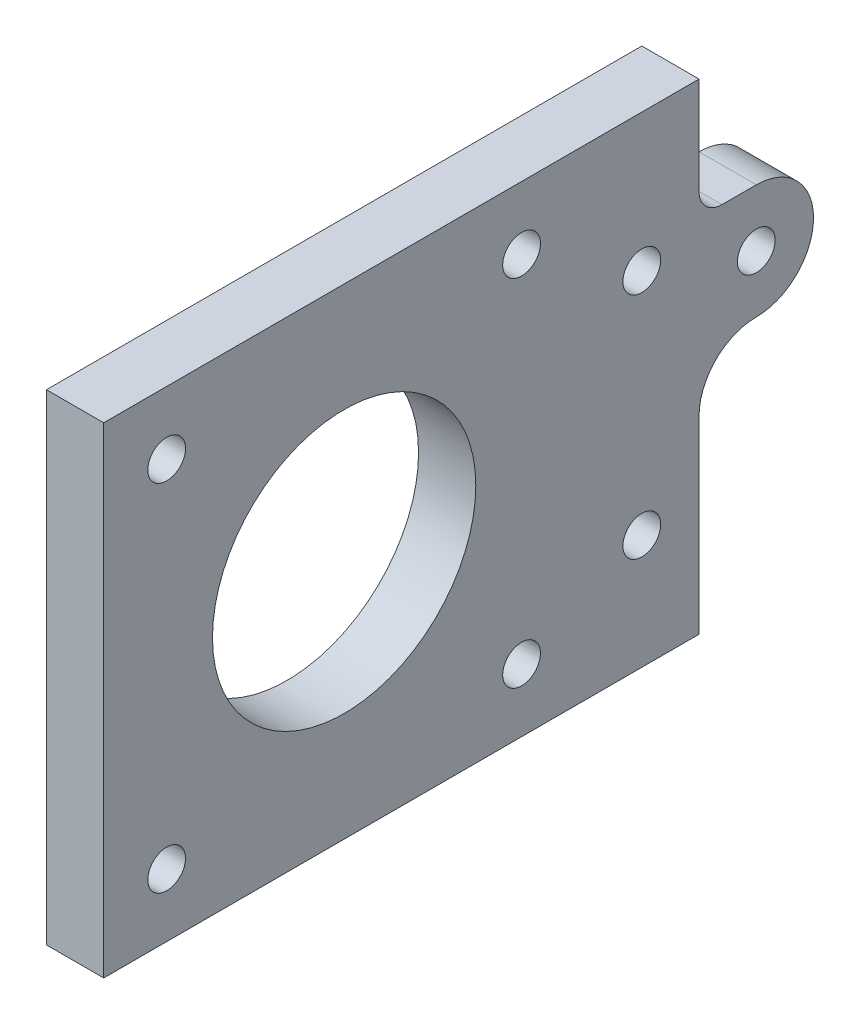
ISO-10303-21;
HEADER;
FILE_DESCRIPTION(('STEP AP214'),'2;1');
FILE_NAME('part.step','',(''),(''),'','','');
FILE_SCHEMA(('AUTOMOTIVE_DESIGN { 1 0 10303 214 1 1 1 1 }'));
ENDSEC;
DATA;
#1=APPLICATION_CONTEXT('core data for automotive mechanical design processes');
#2=APPLICATION_PROTOCOL_DEFINITION('international standard','automotive_design',2000,#1);
#3=PRODUCT_CONTEXT('',#1,'mechanical');
#4=PRODUCT('Part','Part','',(#3));
#5=PRODUCT_RELATED_PRODUCT_CATEGORY('part','',(#4));
#6=PRODUCT_DEFINITION_FORMATION('','',#4);
#7=PRODUCT_DEFINITION_CONTEXT('part definition',#1,'design');
#8=PRODUCT_DEFINITION('design','',#6,#7);
#9=PRODUCT_DEFINITION_SHAPE('','',#8);
#10=(LENGTH_UNIT() NAMED_UNIT(*) SI_UNIT(.MILLI.,.METRE.));
#11=(NAMED_UNIT(*) PLANE_ANGLE_UNIT() SI_UNIT($,.RADIAN.));
#12=(NAMED_UNIT(*) SI_UNIT($,.STERADIAN.) SOLID_ANGLE_UNIT());
#13=UNCERTAINTY_MEASURE_WITH_UNIT(LENGTH_MEASURE(1.E-05),#10,'distance_accuracy_value','');
#14=(GEOMETRIC_REPRESENTATION_CONTEXT(3) GLOBAL_UNCERTAINTY_ASSIGNED_CONTEXT((#13)) GLOBAL_UNIT_ASSIGNED_CONTEXT((#10,
#11,#12)) REPRESENTATION_CONTEXT('',''));
#15=CARTESIAN_POINT('',(0.,0.,0.));
#16=DIRECTION('',(0.,0.,1.));
#17=DIRECTION('',(1.,0.,0.));
#18=AXIS2_PLACEMENT_3D('',#15,#16,#17);
#19=CARTESIAN_POINT('',(0.,0.,-52.));
#20=DIRECTION('',(0.,0.,-1.));
#21=DIRECTION('',(0.,1.,0.));
#22=AXIS2_PLACEMENT_3D('',#19,#20,#21);
#23=PLANE('',#22);
#24=DIRECTION('',(0.,1.,0.));
#25=VECTOR('',#24,1.);
#26=CARTESIAN_POINT('',(0.,-42.,-52.));
#27=LINE('',#26,#25);
#28=CARTESIAN_POINT('',(0.,-42.,-52.));
#29=VERTEX_POINT('',#28);
#30=CARTESIAN_POINT('',(0.,-25.5,-52.));
#31=VERTEX_POINT('',#30);
#32=EDGE_CURVE('E115',#29,#31,#27,.T.);
#33=ORIENTED_EDGE('',*,*,#32,.T.);
#34=DIRECTION('',(-1.,0.,0.));
#35=VECTOR('',#34,1.);
#36=CARTESIAN_POINT('',(0.,-25.5,-52.));
#37=LINE('',#36,#35);
#38=CARTESIAN_POINT('',(5.,-25.5,-52.));
#39=VERTEX_POINT('',#38);
#40=EDGE_CURVE('E202',#31,#39,#37,.F.);
#41=ORIENTED_EDGE('',*,*,#40,.T.);
#42=DIRECTION('',(0.,-1.,0.));
#43=VECTOR('',#42,1.);
#44=CARTESIAN_POINT('',(5.,-42.,-52.));
#45=LINE('',#44,#43);
#46=CARTESIAN_POINT('',(5.,-42.,-52.));
#47=VERTEX_POINT('',#46);
#48=EDGE_CURVE('E132',#39,#47,#45,.T.);
#49=ORIENTED_EDGE('',*,*,#48,.T.);
#50=DIRECTION('',(-1.,0.,0.));
#51=VECTOR('',#50,1.);
#52=CARTESIAN_POINT('',(0.,-42.,-52.));
#53=LINE('',#52,#51);
#54=EDGE_CURVE('E139',#47,#29,#53,.T.);
#55=ORIENTED_EDGE('',*,*,#54,.T.);
#56=EDGE_LOOP('',(#33,#41,#49,#55));
#57=FACE_BOUND('',#56,.T.);
#58=ADVANCED_FACE('F33',(#57),#23,.T.);
#59=CARTESIAN_POINT('',(5.,0.,0.));
#60=DIRECTION('',(0.,0.,-1.));
#61=DIRECTION('',(0.,1.,0.));
#62=AXIS2_PLACEMENT_3D('',#59,#60,#61);
#63=PLANE('',#62);
#64=DIRECTION('',(0.,-1.,0.));
#65=VECTOR('',#64,1.);
#66=CARTESIAN_POINT('',(0.,0.,0.));
#67=LINE('',#66,#65);
#68=CARTESIAN_POINT('',(0.,0.,0.));
#69=VERTEX_POINT('',#68);
#70=CARTESIAN_POINT('',(0.,-42.,0.));
#71=VERTEX_POINT('',#70);
#72=EDGE_CURVE('E123',#69,#71,#67,.T.);
#73=ORIENTED_EDGE('',*,*,#72,.T.);
#74=DIRECTION('',(-1.,0.,0.));
#75=VECTOR('',#74,1.);
#76=CARTESIAN_POINT('',(5.,-42.,0.));
#77=LINE('',#76,#75);
#78=CARTESIAN_POINT('',(5.,-42.,0.));
#79=VERTEX_POINT('',#78);
#80=EDGE_CURVE('E176',#79,#71,#77,.T.);
#81=ORIENTED_EDGE('',*,*,#80,.F.);
#82=DIRECTION('',(0.,-1.,0.));
#83=VECTOR('',#82,1.);
#84=CARTESIAN_POINT('',(5.,0.,0.));
#85=LINE('',#84,#83);
#86=CARTESIAN_POINT('',(5.,0.,0.));
#87=VERTEX_POINT('',#86);
#88=EDGE_CURVE('E127',#87,#79,#85,.T.);
#89=ORIENTED_EDGE('',*,*,#88,.F.);
#90=DIRECTION('',(-1.,0.,0.));
#91=VECTOR('',#90,1.);
#92=CARTESIAN_POINT('',(5.,0.,0.));
#93=LINE('',#92,#91);
#94=EDGE_CURVE('E172',#87,#69,#93,.T.);
#95=ORIENTED_EDGE('',*,*,#94,.T.);
#96=EDGE_LOOP('',(#73,#81,#89,#95));
#97=FACE_BOUND('',#96,.T.);
#98=ADVANCED_FACE('F254',(#97),#63,.F.);
#99=CARTESIAN_POINT('',(5.,-42.,0.));
#100=DIRECTION('',(0.,1.,0.));
#101=DIRECTION('',(0.,0.,1.));
#102=AXIS2_PLACEMENT_3D('',#99,#100,#101);
#103=PLANE('',#102);
#104=DIRECTION('',(0.,0.,-1.));
#105=VECTOR('',#104,1.);
#106=CARTESIAN_POINT('',(0.,-42.,0.));
#107=LINE('',#106,#105);
#108=EDGE_CURVE('E128',#71,#29,#107,.T.);
#109=ORIENTED_EDGE('',*,*,#108,.T.);
#110=ORIENTED_EDGE('',*,*,#54,.F.);
#111=DIRECTION('',(0.,0.,-1.));
#112=VECTOR('',#111,1.);
#113=CARTESIAN_POINT('',(5.,-42.,0.));
#114=LINE('',#113,#112);
#115=EDGE_CURVE('E168',#79,#47,#114,.T.);
#116=ORIENTED_EDGE('',*,*,#115,.F.);
#117=ORIENTED_EDGE('',*,*,#80,.T.);
#118=EDGE_LOOP('',(#109,#110,#116,#117));
#119=FACE_BOUND('',#118,.T.);
#120=ADVANCED_FACE('F260',(#119),#103,.F.);
#121=CARTESIAN_POINT('',(5.,0.,0.));
#122=DIRECTION('',(0.,-1.,0.));
#123=DIRECTION('',(0.,0.,-1.));
#124=AXIS2_PLACEMENT_3D('',#121,#122,#123);
#125=PLANE('',#124);
#126=DIRECTION('',(0.,0.,1.));
#127=VECTOR('',#126,1.);
#128=CARTESIAN_POINT('',(0.,0.,0.));
#129=LINE('',#128,#127);
#130=CARTESIAN_POINT('',(0.,0.,-52.));
#131=VERTEX_POINT('',#130);
#132=EDGE_CURVE('E119',#131,#69,#129,.T.);
#133=ORIENTED_EDGE('',*,*,#132,.T.);
#134=ORIENTED_EDGE('',*,*,#94,.F.);
#135=DIRECTION('',(0.,0.,1.));
#136=VECTOR('',#135,1.);
#137=CARTESIAN_POINT('',(5.,0.,0.));
#138=LINE('',#137,#136);
#139=CARTESIAN_POINT('',(5.,0.,-52.));
#140=VERTEX_POINT('',#139);
#141=EDGE_CURVE('E131',#140,#87,#138,.T.);
#142=ORIENTED_EDGE('',*,*,#141,.F.);
#143=DIRECTION('',(1.,0.,0.));
#144=VECTOR('',#143,1.);
#145=CARTESIAN_POINT('',(0.,0.,-52.));
#146=LINE('',#145,#144);
#147=EDGE_CURVE('E112',#131,#140,#146,.T.);
#148=ORIENTED_EDGE('',*,*,#147,.F.);
#149=EDGE_LOOP('',(#133,#134,#142,#148));
#150=FACE_BOUND('',#149,.T.);
#151=ADVANCED_FACE('F130',(#150),#125,.F.);
#152=CARTESIAN_POINT('',(5.,0.,0.));
#153=DIRECTION('',(1.,0.,0.));
#154=DIRECTION('',(0.,0.,-1.));
#155=AXIS2_PLACEMENT_3D('',#152,#153,#154);
#156=PLANE('',#155);
#157=CARTESIAN_POINT('',(5.,-21.,-21.));
#158=DIRECTION('',(1.,0.,0.));
#159=DIRECTION('',(0.,0.,-1.));
#160=AXIS2_PLACEMENT_3D('',#157,#158,#159);
#161=CIRCLE('',#160,11.5);
#162=CARTESIAN_POINT('',(5.,-21.,-32.5));
#163=VERTEX_POINT('',#162);
#164=EDGE_CURVE('E236',#163,#163,#161,.T.);
#165=ORIENTED_EDGE('',*,*,#164,.F.);
#166=EDGE_LOOP('',(#165));
#167=FACE_BOUND('',#166,.T.);
#168=CARTESIAN_POINT('',(5.,-32.,-47.));
#169=DIRECTION('',(1.,0.,0.));
#170=DIRECTION('',(0.,0.,-1.));
#171=AXIS2_PLACEMENT_3D('',#168,#169,#170);
#172=CIRCLE('',#171,1.65);
#173=CARTESIAN_POINT('',(5.,-32.,-48.65));
#174=VERTEX_POINT('',#173);
#175=EDGE_CURVE('E189',#174,#174,#172,.T.);
#176=ORIENTED_EDGE('',*,*,#175,.F.);
#177=EDGE_LOOP('',(#176));
#178=FACE_BOUND('',#177,.T.);
#179=CARTESIAN_POINT('',(5.,-12.,-47.));
#180=DIRECTION('',(1.,0.,0.));
#181=DIRECTION('',(0.,0.,-1.));
#182=AXIS2_PLACEMENT_3D('',#179,#180,#181);
#183=CIRCLE('',#182,1.65);
#184=CARTESIAN_POINT('',(5.,-12.,-48.65));
#185=VERTEX_POINT('',#184);
#186=EDGE_CURVE('E215',#185,#185,#183,.T.);
#187=ORIENTED_EDGE('',*,*,#186,.F.);
#188=EDGE_LOOP('',(#187));
#189=FACE_BOUND('',#188,.T.);
#190=CARTESIAN_POINT('',(5.,-15.5,-57.));
#191=DIRECTION('',(1.,0.,0.));
#192=DIRECTION('',(0.,0.,-1.));
#193=AXIS2_PLACEMENT_3D('',#190,#191,#192);
#194=CIRCLE('',#193,1.65);
#195=CARTESIAN_POINT('',(5.,-15.5,-58.65));
#196=VERTEX_POINT('',#195);
#197=EDGE_CURVE('E184',#196,#196,#194,.T.);
#198=ORIENTED_EDGE('',*,*,#197,.F.);
#199=EDGE_LOOP('',(#198));
#200=FACE_BOUND('',#199,.T.);
#201=CARTESIAN_POINT('',(5.,-5.5,-36.5));
#202=DIRECTION('',(1.,0.,0.));
#203=DIRECTION('',(0.,0.,-1.));
#204=AXIS2_PLACEMENT_3D('',#201,#202,#203);
#205=CIRCLE('',#204,1.65);
#206=CARTESIAN_POINT('',(5.,-5.5,-38.15));
#207=VERTEX_POINT('',#206);
#208=EDGE_CURVE('E147',#207,#207,#205,.T.);
#209=ORIENTED_EDGE('',*,*,#208,.F.);
#210=EDGE_LOOP('',(#209));
#211=FACE_BOUND('',#210,.T.);
#212=CARTESIAN_POINT('',(5.,-36.5,-36.5000000000003));
#213=DIRECTION('',(1.,0.,0.));
#214=DIRECTION('',(0.,0.,-1.));
#215=AXIS2_PLACEMENT_3D('',#212,#213,#214);
#216=CIRCLE('',#215,1.65);
#217=CARTESIAN_POINT('',(5.,-36.5,-38.1500000000003));
#218=VERTEX_POINT('',#217);
#219=EDGE_CURVE('E153',#218,#218,#216,.T.);
#220=ORIENTED_EDGE('',*,*,#219,.F.);
#221=EDGE_LOOP('',(#220));
#222=FACE_BOUND('',#221,.T.);
#223=CARTESIAN_POINT('',(5.,-36.5,-5.50000000000032));
#224=DIRECTION('',(1.,0.,0.));
#225=DIRECTION('',(0.,0.,-1.));
#226=AXIS2_PLACEMENT_3D('',#223,#224,#225);
#227=CIRCLE('',#226,1.65);
#228=CARTESIAN_POINT('',(5.,-36.5,-7.15000000000032));
#229=VERTEX_POINT('',#228);
#230=EDGE_CURVE('E142',#229,#229,#227,.T.);
#231=ORIENTED_EDGE('',*,*,#230,.F.);
#232=EDGE_LOOP('',(#231));
#233=FACE_BOUND('',#232,.T.);
#234=CARTESIAN_POINT('',(5.,-5.5,-5.5));
#235=DIRECTION('',(1.,0.,0.));
#236=DIRECTION('',(0.,0.,-1.));
#237=AXIS2_PLACEMENT_3D('',#234,#235,#236);
#238=CIRCLE('',#237,1.65);
#239=CARTESIAN_POINT('',(5.,-5.5,-7.15));
#240=VERTEX_POINT('',#239);
#241=EDGE_CURVE('E146',#240,#240,#238,.T.);
#242=ORIENTED_EDGE('',*,*,#241,.F.);
#243=EDGE_LOOP('',(#242));
#244=FACE_BOUND('',#243,.T.);
#245=CARTESIAN_POINT('',(5.,-15.5,-57.));
#246=DIRECTION('',(1.,0.,0.));
#247=DIRECTION('',(0.,0.,-1.));
#248=AXIS2_PLACEMENT_3D('',#245,#246,#247);
#249=CIRCLE('',#248,5.);
#250=CARTESIAN_POINT('',(5.,-20.5,-57.));
#251=VERTEX_POINT('',#250);
#252=CARTESIAN_POINT('',(5.,-15.5,-62.));
#253=VERTEX_POINT('',#252);
#254=EDGE_CURVE('E179',#251,#253,#249,.T.);
#255=ORIENTED_EDGE('',*,*,#254,.T.);
#256=CARTESIAN_POINT('',(5.,-15.5,-57.));
#257=DIRECTION('',(1.,0.,0.));
#258=DIRECTION('',(0.,0.,-1.));
#259=AXIS2_PLACEMENT_3D('',#256,#257,#258);
#260=CIRCLE('',#259,5.);
#261=CARTESIAN_POINT('',(5.,-10.5,-57.));
#262=VERTEX_POINT('',#261);
#263=EDGE_CURVE('E193',#253,#262,#260,.T.);
#264=ORIENTED_EDGE('',*,*,#263,.T.);
#265=DIRECTION('',(0.,0.,1.));
#266=VECTOR('',#265,1.);
#267=CARTESIAN_POINT('',(5.,-10.5,-62.));
#268=LINE('',#267,#266);
#269=CARTESIAN_POINT('',(5.,-10.5,-54.));
#270=VERTEX_POINT('',#269);
#271=EDGE_CURVE('E183',#262,#270,#268,.T.);
#272=ORIENTED_EDGE('',*,*,#271,.T.);
#273=CARTESIAN_POINT('',(5.,-8.5,-54.));
#274=DIRECTION('',(1.,0.,0.));
#275=DIRECTION('',(0.,0.,-1.));
#276=AXIS2_PLACEMENT_3D('',#273,#274,#275);
#277=CIRCLE('',#276,2.);
#278=CARTESIAN_POINT('',(5.,-8.50000000000001,-52.));
#279=VERTEX_POINT('',#278);
#280=EDGE_CURVE('E42',#270,#279,#277,.F.);
#281=ORIENTED_EDGE('',*,*,#280,.T.);
#282=EDGE_CURVE('E134',#140,#279,#45,.T.);
#283=ORIENTED_EDGE('',*,*,#282,.F.);
#284=ORIENTED_EDGE('',*,*,#141,.T.);
#285=ORIENTED_EDGE('',*,*,#88,.T.);
#286=ORIENTED_EDGE('',*,*,#115,.T.);
#287=ORIENTED_EDGE('',*,*,#48,.F.);
#288=CARTESIAN_POINT('',(5.,-25.5,-57.));
#289=DIRECTION('',(1.,0.,0.));
#290=DIRECTION('',(0.,0.,-1.));
#291=AXIS2_PLACEMENT_3D('',#288,#289,#290);
#292=CIRCLE('',#291,5.);
#293=EDGE_CURVE('E206',#39,#251,#292,.F.);
#294=ORIENTED_EDGE('',*,*,#293,.T.);
#295=EDGE_LOOP('',(#255,#264,#272,#281,#283,#284,#285,#286,#287,#294));
#296=FACE_BOUND('',#295,.T.);
#297=ADVANCED_FACE('F226',(#167,#178,#189,#200,#211,#222,#233,#244,#296),#156,.T.);
#298=CARTESIAN_POINT('',(0.,0.,0.));
#299=DIRECTION('',(1.,0.,0.));
#300=DIRECTION('',(0.,0.,-1.));
#301=AXIS2_PLACEMENT_3D('',#298,#299,#300);
#302=PLANE('',#301);
#303=CARTESIAN_POINT('',(0.,-21.,-21.));
#304=DIRECTION('',(1.,0.,0.));
#305=DIRECTION('',(0.,0.,-1.));
#306=AXIS2_PLACEMENT_3D('',#303,#304,#305);
#307=CIRCLE('',#306,11.5);
#308=CARTESIAN_POINT('',(0.,-21.,-32.5));
#309=VERTEX_POINT('',#308);
#310=EDGE_CURVE('E37',#309,#309,#307,.T.);
#311=ORIENTED_EDGE('',*,*,#310,.T.);
#312=EDGE_LOOP('',(#311));
#313=FACE_BOUND('',#312,.T.);
#314=CARTESIAN_POINT('',(0.,-32.,-47.));
#315=DIRECTION('',(1.,0.,0.));
#316=DIRECTION('',(0.,0.,-1.));
#317=AXIS2_PLACEMENT_3D('',#314,#315,#316);
#318=CIRCLE('',#317,1.65);
#319=CARTESIAN_POINT('',(0.,-32.,-48.65));
#320=VERTEX_POINT('',#319);
#321=EDGE_CURVE('E188',#320,#320,#318,.T.);
#322=ORIENTED_EDGE('',*,*,#321,.T.);
#323=EDGE_LOOP('',(#322));
#324=FACE_BOUND('',#323,.T.);
#325=CARTESIAN_POINT('',(0.,-12.,-47.));
#326=DIRECTION('',(1.,0.,0.));
#327=DIRECTION('',(0.,0.,-1.));
#328=AXIS2_PLACEMENT_3D('',#325,#326,#327);
#329=CIRCLE('',#328,1.65);
#330=CARTESIAN_POINT('',(0.,-12.,-48.65));
#331=VERTEX_POINT('',#330);
#332=EDGE_CURVE('E185',#331,#331,#329,.T.);
#333=ORIENTED_EDGE('',*,*,#332,.T.);
#334=EDGE_LOOP('',(#333));
#335=FACE_BOUND('',#334,.T.);
#336=CARTESIAN_POINT('',(0.,-15.5,-57.));
#337=DIRECTION('',(1.,0.,0.));
#338=DIRECTION('',(0.,0.,-1.));
#339=AXIS2_PLACEMENT_3D('',#336,#337,#338);
#340=CIRCLE('',#339,1.65);
#341=CARTESIAN_POINT('',(0.,-15.5,-58.65));
#342=VERTEX_POINT('',#341);
#343=EDGE_CURVE('E180',#342,#342,#340,.T.);
#344=ORIENTED_EDGE('',*,*,#343,.T.);
#345=EDGE_LOOP('',(#344));
#346=FACE_BOUND('',#345,.T.);
#347=CARTESIAN_POINT('',(0.,-5.5,-36.5));
#348=DIRECTION('',(1.,0.,0.));
#349=DIRECTION('',(0.,0.,-1.));
#350=AXIS2_PLACEMENT_3D('',#347,#348,#349);
#351=CIRCLE('',#350,1.65);
#352=CARTESIAN_POINT('',(0.,-5.5,-38.15));
#353=VERTEX_POINT('',#352);
#354=EDGE_CURVE('E143',#353,#353,#351,.T.);
#355=ORIENTED_EDGE('',*,*,#354,.T.);
#356=EDGE_LOOP('',(#355));
#357=FACE_BOUND('',#356,.T.);
#358=CARTESIAN_POINT('',(0.,-36.5,-36.5000000000003));
#359=DIRECTION('',(1.,0.,0.));
#360=DIRECTION('',(0.,0.,-1.));
#361=AXIS2_PLACEMENT_3D('',#358,#359,#360);
#362=CIRCLE('',#361,1.65);
#363=CARTESIAN_POINT('',(0.,-36.5,-38.1500000000003));
#364=VERTEX_POINT('',#363);
#365=EDGE_CURVE('E150',#364,#364,#362,.T.);
#366=ORIENTED_EDGE('',*,*,#365,.T.);
#367=EDGE_LOOP('',(#366));
#368=FACE_BOUND('',#367,.T.);
#369=CARTESIAN_POINT('',(0.,-36.5,-5.50000000000032));
#370=DIRECTION('',(1.,0.,0.));
#371=DIRECTION('',(0.,0.,-1.));
#372=AXIS2_PLACEMENT_3D('',#369,#370,#371);
#373=CIRCLE('',#372,1.65);
#374=CARTESIAN_POINT('',(0.,-36.5,-7.15000000000032));
#375=VERTEX_POINT('',#374);
#376=EDGE_CURVE('E156',#375,#375,#373,.T.);
#377=ORIENTED_EDGE('',*,*,#376,.T.);
#378=EDGE_LOOP('',(#377));
#379=FACE_BOUND('',#378,.T.);
#380=CARTESIAN_POINT('',(0.,-5.5,-5.5));
#381=DIRECTION('',(1.,0.,0.));
#382=DIRECTION('',(0.,0.,-1.));
#383=AXIS2_PLACEMENT_3D('',#380,#381,#382);
#384=CIRCLE('',#383,1.65);
#385=CARTESIAN_POINT('',(0.,-5.5,-7.15));
#386=VERTEX_POINT('',#385);
#387=EDGE_CURVE('E161',#386,#386,#384,.T.);
#388=ORIENTED_EDGE('',*,*,#387,.T.);
#389=EDGE_LOOP('',(#388));
#390=FACE_BOUND('',#389,.T.);
#391=DIRECTION('',(0.,0.,1.));
#392=VECTOR('',#391,1.);
#393=CARTESIAN_POINT('',(0.,-10.5,-62.));
#394=LINE('',#393,#392);
#395=CARTESIAN_POINT('',(0.,-10.5,-57.));
#396=VERTEX_POINT('',#395);
#397=CARTESIAN_POINT('',(0.,-10.5,-54.));
#398=VERTEX_POINT('',#397);
#399=EDGE_CURVE('E116',#396,#398,#394,.T.);
#400=ORIENTED_EDGE('',*,*,#399,.F.);
#401=CARTESIAN_POINT('',(0.,-15.5,-57.));
#402=DIRECTION('',(1.,0.,0.));
#403=DIRECTION('',(0.,0.,-1.));
#404=AXIS2_PLACEMENT_3D('',#401,#402,#403);
#405=CIRCLE('',#404,5.);
#406=CARTESIAN_POINT('',(0.,-15.5,-62.));
#407=VERTEX_POINT('',#406);
#408=EDGE_CURVE('E200',#396,#407,#405,.F.);
#409=ORIENTED_EDGE('',*,*,#408,.T.);
#410=CARTESIAN_POINT('',(0.,-15.5,-57.));
#411=DIRECTION('',(1.,0.,0.));
#412=DIRECTION('',(0.,0.,-1.));
#413=AXIS2_PLACEMENT_3D('',#410,#411,#412);
#414=CIRCLE('',#413,5.);
#415=CARTESIAN_POINT('',(0.,-20.5,-57.));
#416=VERTEX_POINT('',#415);
#417=EDGE_CURVE('E198',#407,#416,#414,.F.);
#418=ORIENTED_EDGE('',*,*,#417,.T.);
#419=CARTESIAN_POINT('',(0.,-25.5,-57.));
#420=DIRECTION('',(1.,0.,0.));
#421=DIRECTION('',(0.,0.,-1.));
#422=AXIS2_PLACEMENT_3D('',#419,#420,#421);
#423=CIRCLE('',#422,5.);
#424=EDGE_CURVE('E204',#416,#31,#423,.T.);
#425=ORIENTED_EDGE('',*,*,#424,.T.);
#426=ORIENTED_EDGE('',*,*,#32,.F.);
#427=ORIENTED_EDGE('',*,*,#108,.F.);
#428=ORIENTED_EDGE('',*,*,#72,.F.);
#429=ORIENTED_EDGE('',*,*,#132,.F.);
#430=CARTESIAN_POINT('',(0.,-8.50000000000001,-52.));
#431=VERTEX_POINT('',#430);
#432=EDGE_CURVE('E108',#431,#131,#27,.T.);
#433=ORIENTED_EDGE('',*,*,#432,.F.);
#434=CARTESIAN_POINT('',(0.,-8.5,-54.));
#435=DIRECTION('',(1.,0.,0.));
#436=DIRECTION('',(0.,0.,-1.));
#437=AXIS2_PLACEMENT_3D('',#434,#435,#436);
#438=CIRCLE('',#437,2.);
#439=EDGE_CURVE('E11',#431,#398,#438,.T.);
#440=ORIENTED_EDGE('',*,*,#439,.T.);
#441=EDGE_LOOP('',(#400,#409,#418,#425,#426,#427,#428,#429,#433,#440));
#442=FACE_BOUND('',#441,.T.);
#443=ADVANCED_FACE('F121',(#313,#324,#335,#346,#357,#368,#379,#390,#442),#302,.F.);
#444=CARTESIAN_POINT('',(0.,-5.5,-5.5));
#445=DIRECTION('',(1.,0.,0.));
#446=DIRECTION('',(0.,0.,-1.));
#447=AXIS2_PLACEMENT_3D('',#444,#445,#446);
#448=CYLINDRICAL_SURFACE('',#447,1.65);
#449=ORIENTED_EDGE('',*,*,#387,.F.);
#450=EDGE_LOOP('',(#449));
#451=FACE_BOUND('',#450,.T.);
#452=ORIENTED_EDGE('',*,*,#241,.T.);
#453=EDGE_LOOP('',(#452));
#454=FACE_BOUND('',#453,.T.);
#455=ADVANCED_FACE('F285',(#451,#454),#448,.F.);
#456=CARTESIAN_POINT('',(0.,-36.5,-5.50000000000032));
#457=DIRECTION('',(1.,0.,0.));
#458=DIRECTION('',(0.,0.,-1.));
#459=AXIS2_PLACEMENT_3D('',#456,#457,#458);
#460=CYLINDRICAL_SURFACE('',#459,1.65);
#461=ORIENTED_EDGE('',*,*,#376,.F.);
#462=EDGE_LOOP('',(#461));
#463=FACE_BOUND('',#462,.T.);
#464=ORIENTED_EDGE('',*,*,#230,.T.);
#465=EDGE_LOOP('',(#464));
#466=FACE_BOUND('',#465,.T.);
#467=ADVANCED_FACE('F277',(#463,#466),#460,.F.);
#468=CARTESIAN_POINT('',(0.,-36.5,-36.5000000000003));
#469=DIRECTION('',(1.,0.,0.));
#470=DIRECTION('',(0.,0.,-1.));
#471=AXIS2_PLACEMENT_3D('',#468,#469,#470);
#472=CYLINDRICAL_SURFACE('',#471,1.65);
#473=ORIENTED_EDGE('',*,*,#365,.F.);
#474=EDGE_LOOP('',(#473));
#475=FACE_BOUND('',#474,.T.);
#476=ORIENTED_EDGE('',*,*,#219,.T.);
#477=EDGE_LOOP('',(#476));
#478=FACE_BOUND('',#477,.T.);
#479=ADVANCED_FACE('F272',(#475,#478),#472,.F.);
#480=CARTESIAN_POINT('',(0.,-5.5,-36.5));
#481=DIRECTION('',(1.,0.,0.));
#482=DIRECTION('',(0.,0.,-1.));
#483=AXIS2_PLACEMENT_3D('',#480,#481,#482);
#484=CYLINDRICAL_SURFACE('',#483,1.65);
#485=ORIENTED_EDGE('',*,*,#354,.F.);
#486=EDGE_LOOP('',(#485));
#487=FACE_BOUND('',#486,.T.);
#488=ORIENTED_EDGE('',*,*,#208,.T.);
#489=EDGE_LOOP('',(#488));
#490=FACE_BOUND('',#489,.T.);
#491=ADVANCED_FACE('F266',(#487,#490),#484,.F.);
#492=ORIENTED_EDGE('',*,*,#282,.T.);
#493=DIRECTION('',(1.,0.,0.));
#494=VECTOR('',#493,1.);
#495=CARTESIAN_POINT('',(0.,-8.5,-52.));
#496=LINE('',#495,#494);
#497=EDGE_CURVE('E55',#279,#431,#496,.F.);
#498=ORIENTED_EDGE('',*,*,#497,.T.);
#499=ORIENTED_EDGE('',*,*,#432,.T.);
#500=ORIENTED_EDGE('',*,*,#147,.T.);
#501=EDGE_LOOP('',(#492,#498,#499,#500));
#502=FACE_BOUND('',#501,.T.);
#503=ADVANCED_FACE('F110',(#502),#23,.T.);
#504=CARTESIAN_POINT('',(0.,-10.5,-62.));
#505=DIRECTION('',(0.,-1.,0.));
#506=DIRECTION('',(1.,0.,0.));
#507=AXIS2_PLACEMENT_3D('',#504,#505,#506);
#508=PLANE('',#507);
#509=ORIENTED_EDGE('',*,*,#399,.T.);
#510=DIRECTION('',(1.,0.,0.));
#511=VECTOR('',#510,1.);
#512=CARTESIAN_POINT('',(0.,-10.5,-54.));
#513=LINE('',#512,#511);
#514=EDGE_CURVE('E208',#398,#270,#513,.T.);
#515=ORIENTED_EDGE('',*,*,#514,.T.);
#516=ORIENTED_EDGE('',*,*,#271,.F.);
#517=DIRECTION('',(1.,0.,0.));
#518=VECTOR('',#517,1.);
#519=CARTESIAN_POINT('',(0.,-10.5,-57.));
#520=LINE('',#519,#518);
#521=EDGE_CURVE('E195',#262,#396,#520,.F.);
#522=ORIENTED_EDGE('',*,*,#521,.T.);
#523=EDGE_LOOP('',(#509,#515,#516,#522));
#524=FACE_BOUND('',#523,.T.);
#525=ADVANCED_FACE('F223',(#524),#508,.F.);
#526=CARTESIAN_POINT('',(-5.,-15.5,-57.));
#527=DIRECTION('',(1.,0.,0.));
#528=DIRECTION('',(0.,0.,-1.));
#529=AXIS2_PLACEMENT_3D('',#526,#527,#528);
#530=CYLINDRICAL_SURFACE('',#529,1.65);
#531=ORIENTED_EDGE('',*,*,#197,.T.);
#532=EDGE_LOOP('',(#531));
#533=FACE_BOUND('',#532,.T.);
#534=ORIENTED_EDGE('',*,*,#343,.F.);
#535=EDGE_LOOP('',(#534));
#536=FACE_BOUND('',#535,.T.);
#537=ADVANCED_FACE('F271',(#533,#536),#530,.F.);
#538=CARTESIAN_POINT('',(-5.,-12.,-47.));
#539=DIRECTION('',(1.,0.,0.));
#540=DIRECTION('',(0.,0.,-1.));
#541=AXIS2_PLACEMENT_3D('',#538,#539,#540);
#542=CYLINDRICAL_SURFACE('',#541,1.65);
#543=ORIENTED_EDGE('',*,*,#186,.T.);
#544=EDGE_LOOP('',(#543));
#545=FACE_BOUND('',#544,.T.);
#546=ORIENTED_EDGE('',*,*,#332,.F.);
#547=EDGE_LOOP('',(#546));
#548=FACE_BOUND('',#547,.T.);
#549=ADVANCED_FACE('F313',(#545,#548),#542,.F.);
#550=CARTESIAN_POINT('',(-5.,-32.,-47.));
#551=DIRECTION('',(1.,0.,0.));
#552=DIRECTION('',(0.,0.,-1.));
#553=AXIS2_PLACEMENT_3D('',#550,#551,#552);
#554=CYLINDRICAL_SURFACE('',#553,1.65);
#555=ORIENTED_EDGE('',*,*,#175,.T.);
#556=EDGE_LOOP('',(#555));
#557=FACE_BOUND('',#556,.T.);
#558=ORIENTED_EDGE('',*,*,#321,.F.);
#559=EDGE_LOOP('',(#558));
#560=FACE_BOUND('',#559,.T.);
#561=ADVANCED_FACE('F308',(#557,#560),#554,.F.);
#562=CARTESIAN_POINT('',(0.,-25.5,-57.));
#563=DIRECTION('',(-1.,0.,0.));
#564=DIRECTION('',(0.,0.,1.));
#565=AXIS2_PLACEMENT_3D('',#562,#563,#564);
#566=CYLINDRICAL_SURFACE('',#565,5.);
#567=ORIENTED_EDGE('',*,*,#40,.F.);
#568=ORIENTED_EDGE('',*,*,#424,.F.);
#569=DIRECTION('',(-1.,0.,0.));
#570=VECTOR('',#569,1.);
#571=CARTESIAN_POINT('',(0.,-20.5,-57.));
#572=LINE('',#571,#570);
#573=EDGE_CURVE('E212',#251,#416,#572,.T.);
#574=ORIENTED_EDGE('',*,*,#573,.F.);
#575=ORIENTED_EDGE('',*,*,#293,.F.);
#576=EDGE_LOOP('',(#567,#568,#574,#575));
#577=FACE_BOUND('',#576,.T.);
#578=ADVANCED_FACE('F305',(#577),#566,.F.);
#579=CARTESIAN_POINT('',(0.,-15.5,-57.));
#580=DIRECTION('',(1.,0.,0.));
#581=DIRECTION('',(0.,0.,-1.));
#582=AXIS2_PLACEMENT_3D('',#579,#580,#581);
#583=CYLINDRICAL_SURFACE('',#582,5.);
#584=ORIENTED_EDGE('',*,*,#573,.T.);
#585=ORIENTED_EDGE('',*,*,#417,.F.);
#586=DIRECTION('',(-1.,0.,0.));
#587=VECTOR('',#586,1.);
#588=CARTESIAN_POINT('',(0.,-15.5,-62.));
#589=LINE('',#588,#587);
#590=EDGE_CURVE('E209',#253,#407,#589,.T.);
#591=ORIENTED_EDGE('',*,*,#590,.F.);
#592=ORIENTED_EDGE('',*,*,#254,.F.);
#593=EDGE_LOOP('',(#584,#585,#591,#592));
#594=FACE_BOUND('',#593,.T.);
#595=ADVANCED_FACE('F302',(#594),#583,.T.);
#596=CARTESIAN_POINT('',(0.,-15.5,-57.));
#597=DIRECTION('',(-1.,0.,0.));
#598=DIRECTION('',(0.,-1.,0.));
#599=AXIS2_PLACEMENT_3D('',#596,#597,#598);
#600=CYLINDRICAL_SURFACE('',#599,5.);
#601=ORIENTED_EDGE('',*,*,#408,.F.);
#602=ORIENTED_EDGE('',*,*,#521,.F.);
#603=ORIENTED_EDGE('',*,*,#263,.F.);
#604=ORIENTED_EDGE('',*,*,#590,.T.);
#605=EDGE_LOOP('',(#601,#602,#603,#604));
#606=FACE_BOUND('',#605,.T.);
#607=ADVANCED_FACE('F251',(#606),#600,.T.);
#608=CARTESIAN_POINT('',(0.,-8.5,-54.));
#609=DIRECTION('',(1.,0.,0.));
#610=DIRECTION('',(0.,1.,0.));
#611=AXIS2_PLACEMENT_3D('',#608,#609,#610);
#612=CYLINDRICAL_SURFACE('',#611,2.);
#613=ORIENTED_EDGE('',*,*,#439,.F.);
#614=ORIENTED_EDGE('',*,*,#497,.F.);
#615=ORIENTED_EDGE('',*,*,#280,.F.);
#616=ORIENTED_EDGE('',*,*,#514,.F.);
#617=EDGE_LOOP('',(#613,#614,#615,#616));
#618=FACE_BOUND('',#617,.T.);
#619=ADVANCED_FACE('F35',(#618),#612,.F.);
#620=CARTESIAN_POINT('',(-5.,-21.,-21.));
#621=DIRECTION('',(1.,0.,0.));
#622=DIRECTION('',(0.,0.,-1.));
#623=AXIS2_PLACEMENT_3D('',#620,#621,#622);
#624=CYLINDRICAL_SURFACE('',#623,11.5);
#625=ORIENTED_EDGE('',*,*,#164,.T.);
#626=EDGE_LOOP('',(#625));
#627=FACE_BOUND('',#626,.T.);
#628=ORIENTED_EDGE('',*,*,#310,.F.);
#629=EDGE_LOOP('',(#628));
#630=FACE_BOUND('',#629,.T.);
#631=ADVANCED_FACE('F245',(#627,#630),#624,.F.);
#632=CLOSED_SHELL('',(#58,#98,#120,#151,#297,#443,#455,#467,#479,#491,#503,#525,#537,#549,#561,
#578,#595,#607,#619,#631));
#633=MANIFOLD_SOLID_BREP('B2',#632);
#634=ADVANCED_BREP_SHAPE_REPRESENTATION('',(#18,#633),#14);
#635=SHAPE_DEFINITION_REPRESENTATION(#9,#634);
ENDSEC;
END-ISO-10303-21;
